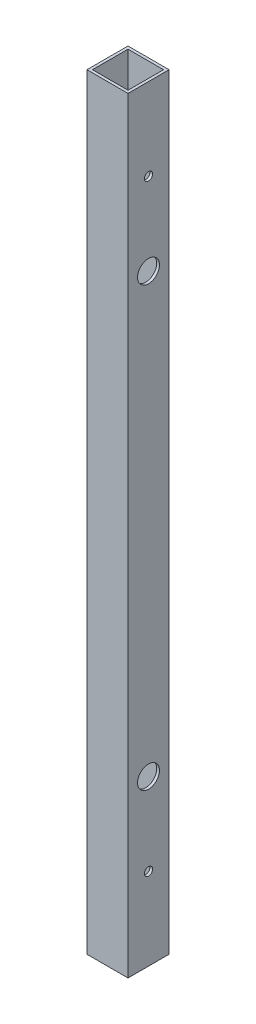
ISO-10303-21;
HEADER;
FILE_DESCRIPTION(('STEP AP214'),'2;1');
FILE_NAME('part.step','',(''),(''),'','','');
FILE_SCHEMA(('AUTOMOTIVE_DESIGN { 1 0 10303 214 1 1 1 1 }'));
ENDSEC;
DATA;
#1=APPLICATION_CONTEXT('core data for automotive mechanical design processes');
#2=APPLICATION_PROTOCOL_DEFINITION('international standard','automotive_design',2000,#1);
#3=PRODUCT_CONTEXT('',#1,'mechanical');
#4=PRODUCT('Part','Part','',(#3));
#5=PRODUCT_RELATED_PRODUCT_CATEGORY('part','',(#4));
#6=PRODUCT_DEFINITION_FORMATION('','',#4);
#7=PRODUCT_DEFINITION_CONTEXT('part definition',#1,'design');
#8=PRODUCT_DEFINITION('design','',#6,#7);
#9=PRODUCT_DEFINITION_SHAPE('','',#8);
#10=(LENGTH_UNIT() NAMED_UNIT(*) SI_UNIT(.MILLI.,.METRE.));
#11=(NAMED_UNIT(*) PLANE_ANGLE_UNIT() SI_UNIT($,.RADIAN.));
#12=(NAMED_UNIT(*) SI_UNIT($,.STERADIAN.) SOLID_ANGLE_UNIT());
#13=UNCERTAINTY_MEASURE_WITH_UNIT(LENGTH_MEASURE(1.E-05),#10,'distance_accuracy_value','');
#14=(GEOMETRIC_REPRESENTATION_CONTEXT(3) GLOBAL_UNCERTAINTY_ASSIGNED_CONTEXT((#13)) GLOBAL_UNIT_ASSIGNED_CONTEXT((#10,
#11,#12)) REPRESENTATION_CONTEXT('',''));
#15=CARTESIAN_POINT('',(0.,0.,0.));
#16=DIRECTION('',(0.,0.,1.));
#17=DIRECTION('',(1.,0.,0.));
#18=AXIS2_PLACEMENT_3D('',#15,#16,#17);
#19=CARTESIAN_POINT('',(0.,280.,0.));
#20=DIRECTION('',(0.,-1.,0.));
#21=DIRECTION('',(0.,0.,-1.));
#22=AXIS2_PLACEMENT_3D('',#19,#20,#21);
#23=PLANE('',#22);
#24=DIRECTION('',(0.,0.,-1.));
#25=VECTOR('',#24,1.);
#26=CARTESIAN_POINT('',(7.5,280.,7.5));
#27=LINE('',#26,#25);
#28=CARTESIAN_POINT('',(7.5,280.,7.5));
#29=VERTEX_POINT('',#28);
#30=CARTESIAN_POINT('',(7.5,280.,-7.5));
#31=VERTEX_POINT('',#30);
#32=EDGE_CURVE('E140',#29,#31,#27,.T.);
#33=ORIENTED_EDGE('',*,*,#32,.T.);
#34=DIRECTION('',(-1.,0.,0.));
#35=VECTOR('',#34,1.);
#36=CARTESIAN_POINT('',(-7.5,280.,-7.5));
#37=LINE('',#36,#35);
#38=CARTESIAN_POINT('',(-7.5,280.,-7.5));
#39=VERTEX_POINT('',#38);
#40=EDGE_CURVE('E143',#31,#39,#37,.T.);
#41=ORIENTED_EDGE('',*,*,#40,.T.);
#42=DIRECTION('',(0.,0.,1.));
#43=VECTOR('',#42,1.);
#44=CARTESIAN_POINT('',(-7.5,280.,7.5));
#45=LINE('',#44,#43);
#46=CARTESIAN_POINT('',(-7.5,280.,7.5));
#47=VERTEX_POINT('',#46);
#48=EDGE_CURVE('E146',#39,#47,#45,.T.);
#49=ORIENTED_EDGE('',*,*,#48,.T.);
#50=DIRECTION('',(1.,0.,0.));
#51=VECTOR('',#50,1.);
#52=CARTESIAN_POINT('',(-7.5,280.,7.5));
#53=LINE('',#52,#51);
#54=EDGE_CURVE('E148',#47,#29,#53,.T.);
#55=ORIENTED_EDGE('',*,*,#54,.T.);
#56=EDGE_LOOP('',(#33,#41,#49,#55));
#57=FACE_BOUND('',#56,.T.);
#58=DIRECTION('',(0.,0.,1.));
#59=VECTOR('',#58,1.);
#60=CARTESIAN_POINT('',(-6.5,280.,6.5));
#61=LINE('',#60,#59);
#62=CARTESIAN_POINT('',(-6.5,280.,-6.5));
#63=VERTEX_POINT('',#62);
#64=CARTESIAN_POINT('',(-6.5,280.,6.5));
#65=VERTEX_POINT('',#64);
#66=EDGE_CURVE('E102',#63,#65,#61,.T.);
#67=ORIENTED_EDGE('',*,*,#66,.F.);
#68=DIRECTION('',(-1.,0.,0.));
#69=VECTOR('',#68,1.);
#70=CARTESIAN_POINT('',(-6.5,280.,-6.5));
#71=LINE('',#70,#69);
#72=CARTESIAN_POINT('',(6.5,280.,-6.5));
#73=VERTEX_POINT('',#72);
#74=EDGE_CURVE('E124',#73,#63,#71,.T.);
#75=ORIENTED_EDGE('',*,*,#74,.F.);
#76=DIRECTION('',(0.,0.,-1.));
#77=VECTOR('',#76,1.);
#78=CARTESIAN_POINT('',(6.5,280.,6.5));
#79=LINE('',#78,#77);
#80=CARTESIAN_POINT('',(6.5,280.,6.5));
#81=VERTEX_POINT('',#80);
#82=EDGE_CURVE('E122',#81,#73,#79,.T.);
#83=ORIENTED_EDGE('',*,*,#82,.F.);
#84=DIRECTION('',(1.,0.,0.));
#85=VECTOR('',#84,1.);
#86=CARTESIAN_POINT('',(-6.5,280.,6.5));
#87=LINE('',#86,#85);
#88=EDGE_CURVE('E110',#65,#81,#87,.T.);
#89=ORIENTED_EDGE('',*,*,#88,.F.);
#90=EDGE_LOOP('',(#67,#75,#83,#89));
#91=FACE_BOUND('',#90,.T.);
#92=ADVANCED_FACE('F35',(#57,#91),#23,.F.);
#93=CARTESIAN_POINT('',(0.,0.,0.));
#94=DIRECTION('',(0.,-1.,0.));
#95=DIRECTION('',(0.,0.,-1.));
#96=AXIS2_PLACEMENT_3D('',#93,#94,#95);
#97=PLANE('',#96);
#98=DIRECTION('',(0.,0.,-1.));
#99=VECTOR('',#98,1.);
#100=CARTESIAN_POINT('',(7.5,0.,7.5));
#101=LINE('',#100,#99);
#102=CARTESIAN_POINT('',(7.5,0.,7.5));
#103=VERTEX_POINT('',#102);
#104=CARTESIAN_POINT('',(7.5,0.,-7.5));
#105=VERTEX_POINT('',#104);
#106=EDGE_CURVE('E118',#103,#105,#101,.T.);
#107=ORIENTED_EDGE('',*,*,#106,.F.);
#108=DIRECTION('',(1.,0.,0.));
#109=VECTOR('',#108,1.);
#110=CARTESIAN_POINT('',(-7.5,0.,7.5));
#111=LINE('',#110,#109);
#112=CARTESIAN_POINT('',(-7.5,0.,7.5));
#113=VERTEX_POINT('',#112);
#114=EDGE_CURVE('E144',#113,#103,#111,.T.);
#115=ORIENTED_EDGE('',*,*,#114,.F.);
#116=DIRECTION('',(0.,0.,1.));
#117=VECTOR('',#116,1.);
#118=CARTESIAN_POINT('',(-7.5,0.,7.5));
#119=LINE('',#118,#117);
#120=CARTESIAN_POINT('',(-7.5,0.,-7.5));
#121=VERTEX_POINT('',#120);
#122=EDGE_CURVE('E155',#121,#113,#119,.T.);
#123=ORIENTED_EDGE('',*,*,#122,.F.);
#124=DIRECTION('',(-1.,0.,0.));
#125=VECTOR('',#124,1.);
#126=CARTESIAN_POINT('',(-7.5,0.,-7.5));
#127=LINE('',#126,#125);
#128=EDGE_CURVE('E153',#105,#121,#127,.T.);
#129=ORIENTED_EDGE('',*,*,#128,.F.);
#130=EDGE_LOOP('',(#107,#115,#123,#129));
#131=FACE_BOUND('',#130,.T.);
#132=DIRECTION('',(-1.,0.,0.));
#133=VECTOR('',#132,1.);
#134=CARTESIAN_POINT('',(-6.5,0.,-6.5));
#135=LINE('',#134,#133);
#136=CARTESIAN_POINT('',(6.5,0.,-6.5));
#137=VERTEX_POINT('',#136);
#138=CARTESIAN_POINT('',(-6.5,0.,-6.5));
#139=VERTEX_POINT('',#138);
#140=EDGE_CURVE('E111',#137,#139,#135,.T.);
#141=ORIENTED_EDGE('',*,*,#140,.T.);
#142=DIRECTION('',(0.,0.,1.));
#143=VECTOR('',#142,1.);
#144=CARTESIAN_POINT('',(-6.5,0.,6.5));
#145=LINE('',#144,#143);
#146=CARTESIAN_POINT('',(-6.5,0.,6.5));
#147=VERTEX_POINT('',#146);
#148=EDGE_CURVE('E60',#139,#147,#145,.T.);
#149=ORIENTED_EDGE('',*,*,#148,.T.);
#150=DIRECTION('',(1.,0.,0.));
#151=VECTOR('',#150,1.);
#152=CARTESIAN_POINT('',(-6.5,0.,6.5));
#153=LINE('',#152,#151);
#154=CARTESIAN_POINT('',(6.5,0.,6.5));
#155=VERTEX_POINT('',#154);
#156=EDGE_CURVE('E117',#147,#155,#153,.T.);
#157=ORIENTED_EDGE('',*,*,#156,.T.);
#158=DIRECTION('',(0.,0.,-1.));
#159=VECTOR('',#158,1.);
#160=CARTESIAN_POINT('',(6.5,0.,6.5));
#161=LINE('',#160,#159);
#162=EDGE_CURVE('E132',#155,#137,#161,.T.);
#163=ORIENTED_EDGE('',*,*,#162,.T.);
#164=EDGE_LOOP('',(#141,#149,#157,#163));
#165=FACE_BOUND('',#164,.T.);
#166=ADVANCED_FACE('F234',(#131,#165),#97,.T.);
#167=CARTESIAN_POINT('',(7.5,280.,7.5));
#168=DIRECTION('',(-1.,0.,0.));
#169=DIRECTION('',(0.,0.,1.));
#170=AXIS2_PLACEMENT_3D('',#167,#168,#169);
#171=PLANE('',#170);
#172=CARTESIAN_POINT('',(7.5,30.,0.));
#173=DIRECTION('',(1.,0.,0.));
#174=DIRECTION('',(0.,0.,1.));
#175=AXIS2_PLACEMENT_3D('',#172,#173,#174);
#176=CIRCLE('',#175,1.5);
#177=CARTESIAN_POINT('',(7.5,30.,1.5));
#178=VERTEX_POINT('',#177);
#179=EDGE_CURVE('E180',#178,#178,#176,.T.);
#180=ORIENTED_EDGE('',*,*,#179,.F.);
#181=EDGE_LOOP('',(#180));
#182=FACE_BOUND('',#181,.T.);
#183=CARTESIAN_POINT('',(7.5,250.,0.));
#184=DIRECTION('',(1.,0.,0.));
#185=DIRECTION('',(0.,0.,-1.));
#186=AXIS2_PLACEMENT_3D('',#183,#184,#185);
#187=CIRCLE('',#186,1.5);
#188=CARTESIAN_POINT('',(7.5,250.,-1.5));
#189=VERTEX_POINT('',#188);
#190=EDGE_CURVE('E177',#189,#189,#187,.T.);
#191=ORIENTED_EDGE('',*,*,#190,.F.);
#192=EDGE_LOOP('',(#191));
#193=FACE_BOUND('',#192,.T.);
#194=CARTESIAN_POINT('',(7.5,220.,0.));
#195=DIRECTION('',(1.,0.,0.));
#196=DIRECTION('',(0.,0.,-1.));
#197=AXIS2_PLACEMENT_3D('',#194,#195,#196);
#198=CIRCLE('',#197,4.);
#199=CARTESIAN_POINT('',(7.5,220.,-4.));
#200=VERTEX_POINT('',#199);
#201=EDGE_CURVE('E173',#200,#200,#198,.T.);
#202=ORIENTED_EDGE('',*,*,#201,.F.);
#203=EDGE_LOOP('',(#202));
#204=FACE_BOUND('',#203,.T.);
#205=CARTESIAN_POINT('',(7.5,60.,0.));
#206=DIRECTION('',(1.,0.,0.));
#207=DIRECTION('',(0.,0.,-1.));
#208=AXIS2_PLACEMENT_3D('',#205,#206,#207);
#209=CIRCLE('',#208,4.);
#210=CARTESIAN_POINT('',(7.5,60.,-4.));
#211=VERTEX_POINT('',#210);
#212=EDGE_CURVE('E169',#211,#211,#209,.T.);
#213=ORIENTED_EDGE('',*,*,#212,.F.);
#214=EDGE_LOOP('',(#213));
#215=FACE_BOUND('',#214,.T.);
#216=ORIENTED_EDGE('',*,*,#106,.T.);
#217=DIRECTION('',(0.,-1.,0.));
#218=VECTOR('',#217,1.);
#219=CARTESIAN_POINT('',(7.5,280.,-7.5));
#220=LINE('',#219,#218);
#221=EDGE_CURVE('E11',#31,#105,#220,.T.);
#222=ORIENTED_EDGE('',*,*,#221,.F.);
#223=ORIENTED_EDGE('',*,*,#32,.F.);
#224=DIRECTION('',(0.,-1.,0.));
#225=VECTOR('',#224,1.);
#226=CARTESIAN_POINT('',(7.5,280.,7.5));
#227=LINE('',#226,#225);
#228=EDGE_CURVE('E150',#29,#103,#227,.T.);
#229=ORIENTED_EDGE('',*,*,#228,.T.);
#230=EDGE_LOOP('',(#216,#222,#223,#229));
#231=FACE_BOUND('',#230,.T.);
#232=ADVANCED_FACE('F37',(#182,#193,#204,#215,#231),#171,.F.);
#233=CARTESIAN_POINT('',(-7.5,280.,-7.5));
#234=DIRECTION('',(0.,0.,1.));
#235=DIRECTION('',(1.,0.,0.));
#236=AXIS2_PLACEMENT_3D('',#233,#234,#235);
#237=PLANE('',#236);
#238=ORIENTED_EDGE('',*,*,#128,.T.);
#239=DIRECTION('',(0.,-1.,0.));
#240=VECTOR('',#239,1.);
#241=CARTESIAN_POINT('',(-7.5,280.,-7.5));
#242=LINE('',#241,#240);
#243=EDGE_CURVE('E44',#39,#121,#242,.T.);
#244=ORIENTED_EDGE('',*,*,#243,.F.);
#245=ORIENTED_EDGE('',*,*,#40,.F.);
#246=ORIENTED_EDGE('',*,*,#221,.T.);
#247=EDGE_LOOP('',(#238,#244,#245,#246));
#248=FACE_BOUND('',#247,.T.);
#249=ADVANCED_FACE('F242',(#248),#237,.F.);
#250=CARTESIAN_POINT('',(-7.5,280.,7.5));
#251=DIRECTION('',(1.,0.,0.));
#252=DIRECTION('',(0.,0.,-1.));
#253=AXIS2_PLACEMENT_3D('',#250,#251,#252);
#254=PLANE('',#253);
#255=CARTESIAN_POINT('',(-7.5,30.,0.));
#256=DIRECTION('',(-1.,0.,0.));
#257=DIRECTION('',(0.,0.,1.));
#258=AXIS2_PLACEMENT_3D('',#255,#256,#257);
#259=CIRCLE('',#258,4.);
#260=CARTESIAN_POINT('',(-7.5,30.,4.));
#261=VERTEX_POINT('',#260);
#262=EDGE_CURVE('E193',#261,#261,#259,.T.);
#263=ORIENTED_EDGE('',*,*,#262,.F.);
#264=EDGE_LOOP('',(#263));
#265=FACE_BOUND('',#264,.T.);
#266=CARTESIAN_POINT('',(-7.5,250.,0.));
#267=DIRECTION('',(-1.,0.,0.));
#268=DIRECTION('',(0.,0.,1.));
#269=AXIS2_PLACEMENT_3D('',#266,#267,#268);
#270=CIRCLE('',#269,4.);
#271=CARTESIAN_POINT('',(-7.5,250.,4.));
#272=VERTEX_POINT('',#271);
#273=EDGE_CURVE('E183',#272,#272,#270,.T.);
#274=ORIENTED_EDGE('',*,*,#273,.F.);
#275=EDGE_LOOP('',(#274));
#276=FACE_BOUND('',#275,.T.);
#277=CARTESIAN_POINT('',(-7.5,60.,0.));
#278=DIRECTION('',(-1.,0.,0.));
#279=DIRECTION('',(0.,0.,-1.));
#280=AXIS2_PLACEMENT_3D('',#277,#278,#279);
#281=CIRCLE('',#280,1.5);
#282=CARTESIAN_POINT('',(-7.5,60.,-1.5));
#283=VERTEX_POINT('',#282);
#284=EDGE_CURVE('E168',#283,#283,#281,.T.);
#285=ORIENTED_EDGE('',*,*,#284,.F.);
#286=EDGE_LOOP('',(#285));
#287=FACE_BOUND('',#286,.T.);
#288=CARTESIAN_POINT('',(-7.5,220.,0.));
#289=DIRECTION('',(-1.,0.,0.));
#290=DIRECTION('',(0.,0.,1.));
#291=AXIS2_PLACEMENT_3D('',#288,#289,#290);
#292=CIRCLE('',#291,1.5);
#293=CARTESIAN_POINT('',(-7.5,220.,1.5));
#294=VERTEX_POINT('',#293);
#295=EDGE_CURVE('E207',#294,#294,#292,.T.);
#296=ORIENTED_EDGE('',*,*,#295,.F.);
#297=EDGE_LOOP('',(#296));
#298=FACE_BOUND('',#297,.T.);
#299=ORIENTED_EDGE('',*,*,#122,.T.);
#300=DIRECTION('',(0.,-1.,0.));
#301=VECTOR('',#300,1.);
#302=CARTESIAN_POINT('',(-7.5,280.,7.5));
#303=LINE('',#302,#301);
#304=EDGE_CURVE('E160',#47,#113,#303,.T.);
#305=ORIENTED_EDGE('',*,*,#304,.F.);
#306=ORIENTED_EDGE('',*,*,#48,.F.);
#307=ORIENTED_EDGE('',*,*,#243,.T.);
#308=EDGE_LOOP('',(#299,#305,#306,#307));
#309=FACE_BOUND('',#308,.T.);
#310=ADVANCED_FACE('F227',(#265,#276,#287,#298,#309),#254,.F.);
#311=CARTESIAN_POINT('',(-7.5,280.,7.5));
#312=DIRECTION('',(0.,0.,-1.));
#313=DIRECTION('',(-1.,0.,0.));
#314=AXIS2_PLACEMENT_3D('',#311,#312,#313);
#315=PLANE('',#314);
#316=ORIENTED_EDGE('',*,*,#114,.T.);
#317=ORIENTED_EDGE('',*,*,#228,.F.);
#318=ORIENTED_EDGE('',*,*,#54,.F.);
#319=ORIENTED_EDGE('',*,*,#304,.T.);
#320=EDGE_LOOP('',(#316,#317,#318,#319));
#321=FACE_BOUND('',#320,.T.);
#322=ADVANCED_FACE('F216',(#321),#315,.F.);
#323=CARTESIAN_POINT('',(-6.5,280.,6.5));
#324=DIRECTION('',(1.,0.,0.));
#325=DIRECTION('',(0.,0.,-1.));
#326=AXIS2_PLACEMENT_3D('',#323,#324,#325);
#327=PLANE('',#326);
#328=CARTESIAN_POINT('',(-6.5,30.,0.));
#329=DIRECTION('',(1.,0.,0.));
#330=DIRECTION('',(0.,0.,-1.));
#331=AXIS2_PLACEMENT_3D('',#328,#329,#330);
#332=CIRCLE('',#331,4.);
#333=CARTESIAN_POINT('',(-6.5,30.,-4.));
#334=VERTEX_POINT('',#333);
#335=EDGE_CURVE('E39',#334,#334,#332,.T.);
#336=ORIENTED_EDGE('',*,*,#335,.F.);
#337=EDGE_LOOP('',(#336));
#338=FACE_BOUND('',#337,.T.);
#339=CARTESIAN_POINT('',(-6.5,250.,0.));
#340=DIRECTION('',(1.,0.,0.));
#341=DIRECTION('',(0.,0.,-1.));
#342=AXIS2_PLACEMENT_3D('',#339,#340,#341);
#343=CIRCLE('',#342,4.);
#344=CARTESIAN_POINT('',(-6.5,250.,-4.));
#345=VERTEX_POINT('',#344);
#346=EDGE_CURVE('E181',#345,#345,#343,.T.);
#347=ORIENTED_EDGE('',*,*,#346,.F.);
#348=EDGE_LOOP('',(#347));
#349=FACE_BOUND('',#348,.T.);
#350=CARTESIAN_POINT('',(-6.50000000000001,60.,0.));
#351=DIRECTION('',(1.,0.,0.));
#352=DIRECTION('',(0.,0.,-1.));
#353=AXIS2_PLACEMENT_3D('',#350,#351,#352);
#354=CIRCLE('',#353,1.5);
#355=CARTESIAN_POINT('',(-6.50000000000001,60.,-1.5));
#356=VERTEX_POINT('',#355);
#357=EDGE_CURVE('E204',#356,#356,#354,.T.);
#358=ORIENTED_EDGE('',*,*,#357,.F.);
#359=EDGE_LOOP('',(#358));
#360=FACE_BOUND('',#359,.T.);
#361=CARTESIAN_POINT('',(-6.50000000000001,220.,0.));
#362=DIRECTION('',(1.,0.,0.));
#363=DIRECTION('',(0.,0.,-1.));
#364=AXIS2_PLACEMENT_3D('',#361,#362,#363);
#365=CIRCLE('',#364,1.5);
#366=CARTESIAN_POINT('',(-6.50000000000001,220.,-1.5));
#367=VERTEX_POINT('',#366);
#368=EDGE_CURVE('E130',#367,#367,#365,.T.);
#369=ORIENTED_EDGE('',*,*,#368,.F.);
#370=EDGE_LOOP('',(#369));
#371=FACE_BOUND('',#370,.T.);
#372=ORIENTED_EDGE('',*,*,#148,.F.);
#373=DIRECTION('',(0.,-1.,0.));
#374=VECTOR('',#373,1.);
#375=CARTESIAN_POINT('',(-6.5,280.,-6.5));
#376=LINE('',#375,#374);
#377=EDGE_CURVE('E106',#63,#139,#376,.T.);
#378=ORIENTED_EDGE('',*,*,#377,.F.);
#379=ORIENTED_EDGE('',*,*,#66,.T.);
#380=DIRECTION('',(0.,-1.,0.));
#381=VECTOR('',#380,1.);
#382=CARTESIAN_POINT('',(-6.5,280.,6.5));
#383=LINE('',#382,#381);
#384=EDGE_CURVE('E105',#65,#147,#383,.T.);
#385=ORIENTED_EDGE('',*,*,#384,.T.);
#386=EDGE_LOOP('',(#372,#378,#379,#385));
#387=FACE_BOUND('',#386,.T.);
#388=ADVANCED_FACE('F104',(#338,#349,#360,#371,#387),#327,.T.);
#389=CARTESIAN_POINT('',(-6.5,280.,6.5));
#390=DIRECTION('',(0.,0.,-1.));
#391=DIRECTION('',(-1.,0.,0.));
#392=AXIS2_PLACEMENT_3D('',#389,#390,#391);
#393=PLANE('',#392);
#394=ORIENTED_EDGE('',*,*,#156,.F.);
#395=ORIENTED_EDGE('',*,*,#384,.F.);
#396=ORIENTED_EDGE('',*,*,#88,.T.);
#397=DIRECTION('',(0.,-1.,0.));
#398=VECTOR('',#397,1.);
#399=CARTESIAN_POINT('',(6.5,280.,6.5));
#400=LINE('',#399,#398);
#401=EDGE_CURVE('E119',#81,#155,#400,.T.);
#402=ORIENTED_EDGE('',*,*,#401,.T.);
#403=EDGE_LOOP('',(#394,#395,#396,#402));
#404=FACE_BOUND('',#403,.T.);
#405=ADVANCED_FACE('F114',(#404),#393,.T.);
#406=CARTESIAN_POINT('',(6.5,280.,6.5));
#407=DIRECTION('',(-1.,0.,0.));
#408=DIRECTION('',(0.,0.,1.));
#409=AXIS2_PLACEMENT_3D('',#406,#407,#408);
#410=PLANE('',#409);
#411=CARTESIAN_POINT('',(6.5,30.,0.));
#412=DIRECTION('',(-1.,0.,0.));
#413=DIRECTION('',(0.,0.,1.));
#414=AXIS2_PLACEMENT_3D('',#411,#412,#413);
#415=CIRCLE('',#414,1.5);
#416=CARTESIAN_POINT('',(6.5,30.,1.5));
#417=VERTEX_POINT('',#416);
#418=EDGE_CURVE('E178',#417,#417,#415,.T.);
#419=ORIENTED_EDGE('',*,*,#418,.F.);
#420=EDGE_LOOP('',(#419));
#421=FACE_BOUND('',#420,.T.);
#422=CARTESIAN_POINT('',(6.5,250.,0.));
#423=DIRECTION('',(-1.,0.,0.));
#424=DIRECTION('',(0.,0.,1.));
#425=AXIS2_PLACEMENT_3D('',#422,#423,#424);
#426=CIRCLE('',#425,1.5);
#427=CARTESIAN_POINT('',(6.5,250.,1.5));
#428=VERTEX_POINT('',#427);
#429=EDGE_CURVE('E174',#428,#428,#426,.T.);
#430=ORIENTED_EDGE('',*,*,#429,.F.);
#431=EDGE_LOOP('',(#430));
#432=FACE_BOUND('',#431,.T.);
#433=CARTESIAN_POINT('',(6.5,220.,0.));
#434=DIRECTION('',(-1.,0.,0.));
#435=DIRECTION('',(0.,0.,1.));
#436=AXIS2_PLACEMENT_3D('',#433,#434,#435);
#437=CIRCLE('',#436,4.);
#438=CARTESIAN_POINT('',(6.5,220.,4.));
#439=VERTEX_POINT('',#438);
#440=EDGE_CURVE('E170',#439,#439,#437,.T.);
#441=ORIENTED_EDGE('',*,*,#440,.F.);
#442=EDGE_LOOP('',(#441));
#443=FACE_BOUND('',#442,.T.);
#444=CARTESIAN_POINT('',(6.5,60.,0.));
#445=DIRECTION('',(-1.,0.,0.));
#446=DIRECTION('',(0.,0.,1.));
#447=AXIS2_PLACEMENT_3D('',#444,#445,#446);
#448=CIRCLE('',#447,4.);
#449=CARTESIAN_POINT('',(6.5,60.,4.));
#450=VERTEX_POINT('',#449);
#451=EDGE_CURVE('E165',#450,#450,#448,.T.);
#452=ORIENTED_EDGE('',*,*,#451,.F.);
#453=EDGE_LOOP('',(#452));
#454=FACE_BOUND('',#453,.T.);
#455=ORIENTED_EDGE('',*,*,#162,.F.);
#456=ORIENTED_EDGE('',*,*,#401,.F.);
#457=ORIENTED_EDGE('',*,*,#82,.T.);
#458=DIRECTION('',(0.,-1.,0.));
#459=VECTOR('',#458,1.);
#460=CARTESIAN_POINT('',(6.5,280.,-6.5));
#461=LINE('',#460,#459);
#462=EDGE_CURVE('E52',#73,#137,#461,.T.);
#463=ORIENTED_EDGE('',*,*,#462,.T.);
#464=EDGE_LOOP('',(#455,#456,#457,#463));
#465=FACE_BOUND('',#464,.T.);
#466=ADVANCED_FACE('F224',(#421,#432,#443,#454,#465),#410,.T.);
#467=CARTESIAN_POINT('',(-6.5,280.,-6.5));
#468=DIRECTION('',(0.,0.,1.));
#469=DIRECTION('',(1.,0.,0.));
#470=AXIS2_PLACEMENT_3D('',#467,#468,#469);
#471=PLANE('',#470);
#472=ORIENTED_EDGE('',*,*,#140,.F.);
#473=ORIENTED_EDGE('',*,*,#462,.F.);
#474=ORIENTED_EDGE('',*,*,#74,.T.);
#475=ORIENTED_EDGE('',*,*,#377,.T.);
#476=EDGE_LOOP('',(#472,#473,#474,#475));
#477=FACE_BOUND('',#476,.T.);
#478=ADVANCED_FACE('F266',(#477),#471,.T.);
#479=CARTESIAN_POINT('',(252.5,220.,0.));
#480=DIRECTION('',(-1.,0.,0.));
#481=DIRECTION('',(0.,0.,1.));
#482=AXIS2_PLACEMENT_3D('',#479,#480,#481);
#483=CYLINDRICAL_SURFACE('',#482,1.5);
#484=ORIENTED_EDGE('',*,*,#368,.T.);
#485=EDGE_LOOP('',(#484));
#486=FACE_BOUND('',#485,.T.);
#487=ORIENTED_EDGE('',*,*,#295,.T.);
#488=EDGE_LOOP('',(#487));
#489=FACE_BOUND('',#488,.T.);
#490=ADVANCED_FACE('F212',(#486,#489),#483,.F.);
#491=CARTESIAN_POINT('',(252.5,60.,0.));
#492=DIRECTION('',(-1.,0.,0.));
#493=DIRECTION('',(0.,0.,1.));
#494=AXIS2_PLACEMENT_3D('',#491,#492,#493);
#495=CYLINDRICAL_SURFACE('',#494,1.5);
#496=ORIENTED_EDGE('',*,*,#357,.T.);
#497=EDGE_LOOP('',(#496));
#498=FACE_BOUND('',#497,.T.);
#499=ORIENTED_EDGE('',*,*,#284,.T.);
#500=EDGE_LOOP('',(#499));
#501=FACE_BOUND('',#500,.T.);
#502=ADVANCED_FACE('F273',(#498,#501),#495,.F.);
#503=CARTESIAN_POINT('',(5.5,60.,0.));
#504=DIRECTION('',(1.,0.,0.));
#505=DIRECTION('',(0.,0.,-1.));
#506=AXIS2_PLACEMENT_3D('',#503,#504,#505);
#507=CYLINDRICAL_SURFACE('',#506,4.);
#508=ORIENTED_EDGE('',*,*,#451,.T.);
#509=EDGE_LOOP('',(#508));
#510=FACE_BOUND('',#509,.T.);
#511=ORIENTED_EDGE('',*,*,#212,.T.);
#512=EDGE_LOOP('',(#511));
#513=FACE_BOUND('',#512,.T.);
#514=ADVANCED_FACE('F281',(#510,#513),#507,.F.);
#515=CARTESIAN_POINT('',(5.5,220.,0.));
#516=DIRECTION('',(1.,0.,0.));
#517=DIRECTION('',(0.,0.,-1.));
#518=AXIS2_PLACEMENT_3D('',#515,#516,#517);
#519=CYLINDRICAL_SURFACE('',#518,4.);
#520=ORIENTED_EDGE('',*,*,#440,.T.);
#521=EDGE_LOOP('',(#520));
#522=FACE_BOUND('',#521,.T.);
#523=ORIENTED_EDGE('',*,*,#201,.T.);
#524=EDGE_LOOP('',(#523));
#525=FACE_BOUND('',#524,.T.);
#526=ADVANCED_FACE('F285',(#522,#525),#519,.F.);
#527=CARTESIAN_POINT('',(-7.5,250.,0.));
#528=DIRECTION('',(1.,0.,0.));
#529=DIRECTION('',(0.,0.,-1.));
#530=AXIS2_PLACEMENT_3D('',#527,#528,#529);
#531=CYLINDRICAL_SURFACE('',#530,1.5);
#532=ORIENTED_EDGE('',*,*,#429,.T.);
#533=EDGE_LOOP('',(#532));
#534=FACE_BOUND('',#533,.T.);
#535=ORIENTED_EDGE('',*,*,#190,.T.);
#536=EDGE_LOOP('',(#535));
#537=FACE_BOUND('',#536,.T.);
#538=ADVANCED_FACE('F289',(#534,#537),#531,.F.);
#539=CARTESIAN_POINT('',(-7.5,30.,0.));
#540=DIRECTION('',(1.,0.,0.));
#541=DIRECTION('',(0.,0.,-1.));
#542=AXIS2_PLACEMENT_3D('',#539,#540,#541);
#543=CYLINDRICAL_SURFACE('',#542,1.5);
#544=ORIENTED_EDGE('',*,*,#418,.T.);
#545=EDGE_LOOP('',(#544));
#546=FACE_BOUND('',#545,.T.);
#547=ORIENTED_EDGE('',*,*,#179,.T.);
#548=EDGE_LOOP('',(#547));
#549=FACE_BOUND('',#548,.T.);
#550=ADVANCED_FACE('F293',(#546,#549),#543,.F.);
#551=CARTESIAN_POINT('',(-5.5,250.,0.));
#552=DIRECTION('',(-1.,0.,0.));
#553=DIRECTION('',(0.,0.,1.));
#554=AXIS2_PLACEMENT_3D('',#551,#552,#553);
#555=CYLINDRICAL_SURFACE('',#554,4.);
#556=ORIENTED_EDGE('',*,*,#346,.T.);
#557=EDGE_LOOP('',(#556));
#558=FACE_BOUND('',#557,.T.);
#559=ORIENTED_EDGE('',*,*,#273,.T.);
#560=EDGE_LOOP('',(#559));
#561=FACE_BOUND('',#560,.T.);
#562=ADVANCED_FACE('F297',(#558,#561),#555,.F.);
#563=CARTESIAN_POINT('',(-5.5,30.,0.));
#564=DIRECTION('',(-1.,0.,0.));
#565=DIRECTION('',(0.,0.,1.));
#566=AXIS2_PLACEMENT_3D('',#563,#564,#565);
#567=CYLINDRICAL_SURFACE('',#566,4.);
#568=ORIENTED_EDGE('',*,*,#335,.T.);
#569=EDGE_LOOP('',(#568));
#570=FACE_BOUND('',#569,.T.);
#571=ORIENTED_EDGE('',*,*,#262,.T.);
#572=EDGE_LOOP('',(#571));
#573=FACE_BOUND('',#572,.T.);
#574=ADVANCED_FACE('F301',(#570,#573),#567,.F.);
#575=CLOSED_SHELL('',(#92,#166,#232,#249,#310,#322,#388,#405,#466,#478,#490,#502,#514,#526,#538,
#550,#562,#574));
#576=MANIFOLD_SOLID_BREP('B2',#575);
#577=ADVANCED_BREP_SHAPE_REPRESENTATION('',(#18,#576),#14);
#578=SHAPE_DEFINITION_REPRESENTATION(#9,#577);
ENDSEC;
END-ISO-10303-21;
